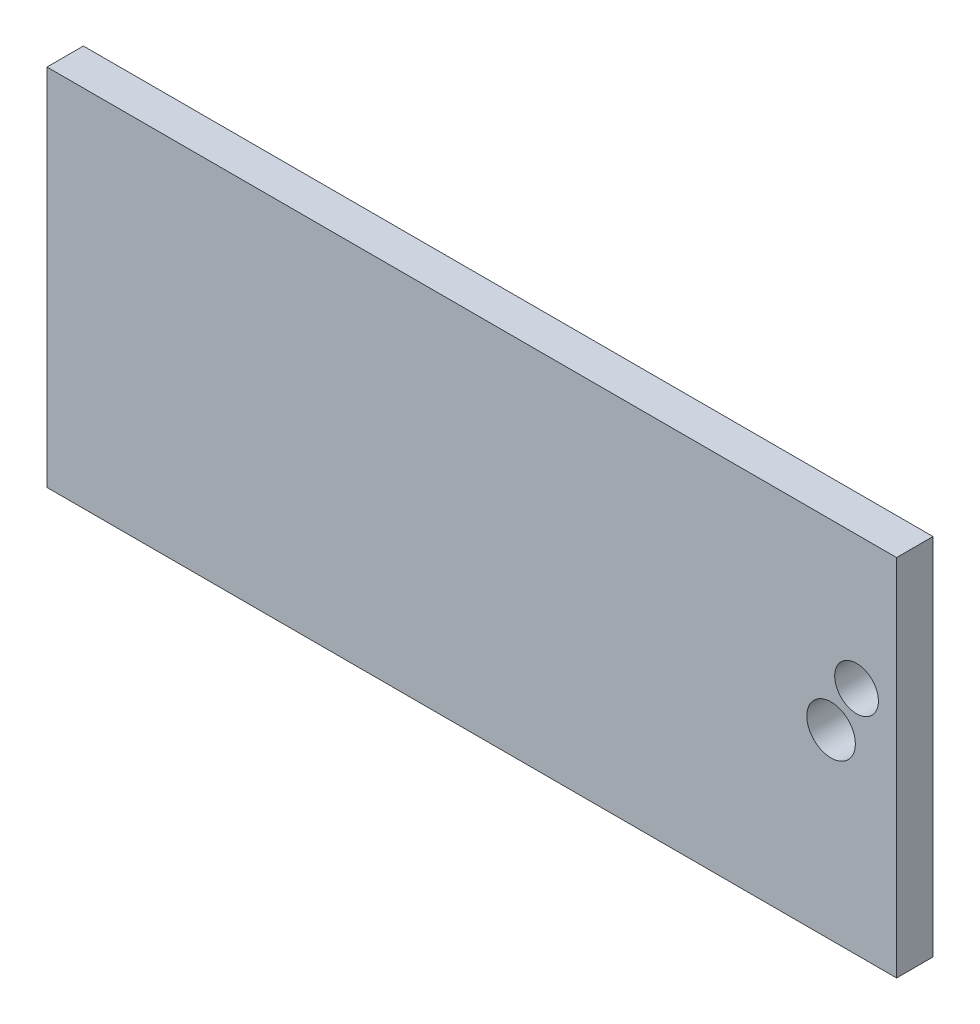
ISO-10303-21;
HEADER;
FILE_DESCRIPTION(('STEP AP214'),'2;1');
FILE_NAME('part.step','',(''),(''),'','','');
FILE_SCHEMA(('AUTOMOTIVE_DESIGN { 1 0 10303 214 1 1 1 1 }'));
ENDSEC;
DATA;
#1=APPLICATION_CONTEXT('core data for automotive mechanical design processes');
#2=APPLICATION_PROTOCOL_DEFINITION('international standard','automotive_design',2000,#1);
#3=PRODUCT_CONTEXT('',#1,'mechanical');
#4=PRODUCT('Part','Part','',(#3));
#5=PRODUCT_RELATED_PRODUCT_CATEGORY('part','',(#4));
#6=PRODUCT_DEFINITION_FORMATION('','',#4);
#7=PRODUCT_DEFINITION_CONTEXT('part definition',#1,'design');
#8=PRODUCT_DEFINITION('design','',#6,#7);
#9=PRODUCT_DEFINITION_SHAPE('','',#8);
#10=(LENGTH_UNIT() NAMED_UNIT(*) SI_UNIT(.MILLI.,.METRE.));
#11=(NAMED_UNIT(*) PLANE_ANGLE_UNIT() SI_UNIT($,.RADIAN.));
#12=(NAMED_UNIT(*) SI_UNIT($,.STERADIAN.) SOLID_ANGLE_UNIT());
#13=UNCERTAINTY_MEASURE_WITH_UNIT(LENGTH_MEASURE(1.E-05),#10,'distance_accuracy_value','');
#14=(GEOMETRIC_REPRESENTATION_CONTEXT(3) GLOBAL_UNCERTAINTY_ASSIGNED_CONTEXT((#13)) GLOBAL_UNIT_ASSIGNED_CONTEXT((#10,
#11,#12)) REPRESENTATION_CONTEXT('',''));
#15=CARTESIAN_POINT('',(0.,0.,0.));
#16=DIRECTION('',(0.,0.,1.));
#17=DIRECTION('',(1.,0.,0.));
#18=AXIS2_PLACEMENT_3D('',#15,#16,#17);
#19=CARTESIAN_POINT('',(0.,0.,15.));
#20=DIRECTION('',(1.,0.,0.));
#21=DIRECTION('',(0.,1.,0.));
#22=AXIS2_PLACEMENT_3D('',#19,#20,#21);
#23=PLANE('',#22);
#24=DIRECTION('',(0.,-1.,0.));
#25=VECTOR('',#24,1.);
#26=CARTESIAN_POINT('',(0.,0.,0.));
#27=LINE('',#26,#25);
#28=CARTESIAN_POINT('',(0.,0.,0.));
#29=VERTEX_POINT('',#28);
#30=CARTESIAN_POINT('',(0.,-150.,0.));
#31=VERTEX_POINT('',#30);
#32=EDGE_CURVE('E109',#29,#31,#27,.T.);
#33=ORIENTED_EDGE('',*,*,#32,.T.);
#34=DIRECTION('',(0.,0.,-1.));
#35=VECTOR('',#34,1.);
#36=CARTESIAN_POINT('',(0.,-150.,15.));
#37=LINE('',#36,#35);
#38=CARTESIAN_POINT('',(0.,-150.,15.));
#39=VERTEX_POINT('',#38);
#40=EDGE_CURVE('E11',#39,#31,#37,.T.);
#41=ORIENTED_EDGE('',*,*,#40,.F.);
#42=DIRECTION('',(0.,-1.,0.));
#43=VECTOR('',#42,1.);
#44=CARTESIAN_POINT('',(0.,0.,15.));
#45=LINE('',#44,#43);
#46=CARTESIAN_POINT('',(0.,0.,15.));
#47=VERTEX_POINT('',#46);
#48=EDGE_CURVE('E91',#47,#39,#45,.T.);
#49=ORIENTED_EDGE('',*,*,#48,.F.);
#50=DIRECTION('',(0.,0.,-1.));
#51=VECTOR('',#50,1.);
#52=CARTESIAN_POINT('',(0.,0.,15.));
#53=LINE('',#52,#51);
#54=EDGE_CURVE('E105',#47,#29,#53,.T.);
#55=ORIENTED_EDGE('',*,*,#54,.T.);
#56=EDGE_LOOP('',(#33,#41,#49,#55));
#57=FACE_BOUND('',#56,.T.);
#58=ADVANCED_FACE('F38',(#57),#23,.F.);
#59=CARTESIAN_POINT('',(0.,-150.,15.));
#60=DIRECTION('',(0.,1.,0.));
#61=DIRECTION('',(0.,0.,1.));
#62=AXIS2_PLACEMENT_3D('',#59,#60,#61);
#63=PLANE('',#62);
#64=DIRECTION('',(1.,0.,0.));
#65=VECTOR('',#64,1.);
#66=CARTESIAN_POINT('',(0.,-150.,0.));
#67=LINE('',#66,#65);
#68=CARTESIAN_POINT('',(350.,-150.,0.));
#69=VERTEX_POINT('',#68);
#70=EDGE_CURVE('E96',#31,#69,#67,.T.);
#71=ORIENTED_EDGE('',*,*,#70,.T.);
#72=DIRECTION('',(0.,0.,-1.));
#73=VECTOR('',#72,1.);
#74=CARTESIAN_POINT('',(350.,-150.,15.));
#75=LINE('',#74,#73);
#76=CARTESIAN_POINT('',(350.,-150.,15.));
#77=VERTEX_POINT('',#76);
#78=EDGE_CURVE('E48',#77,#69,#75,.T.);
#79=ORIENTED_EDGE('',*,*,#78,.F.);
#80=DIRECTION('',(1.,0.,0.));
#81=VECTOR('',#80,1.);
#82=CARTESIAN_POINT('',(0.,-150.,15.));
#83=LINE('',#82,#81);
#84=EDGE_CURVE('E86',#39,#77,#83,.T.);
#85=ORIENTED_EDGE('',*,*,#84,.F.);
#86=ORIENTED_EDGE('',*,*,#40,.T.);
#87=EDGE_LOOP('',(#71,#79,#85,#86));
#88=FACE_BOUND('',#87,.T.);
#89=ADVANCED_FACE('F95',(#88),#63,.F.);
#90=CARTESIAN_POINT('',(350.,0.,15.));
#91=DIRECTION('',(-1.,0.,0.));
#92=DIRECTION('',(0.,0.,1.));
#93=AXIS2_PLACEMENT_3D('',#90,#91,#92);
#94=PLANE('',#93);
#95=DIRECTION('',(0.,1.,0.));
#96=VECTOR('',#95,1.);
#97=CARTESIAN_POINT('',(350.,0.,0.));
#98=LINE('',#97,#96);
#99=CARTESIAN_POINT('',(350.,0.,0.));
#100=VERTEX_POINT('',#99);
#101=EDGE_CURVE('E73',#69,#100,#98,.T.);
#102=ORIENTED_EDGE('',*,*,#101,.T.);
#103=DIRECTION('',(0.,0.,-1.));
#104=VECTOR('',#103,1.);
#105=CARTESIAN_POINT('',(350.,0.,15.));
#106=LINE('',#105,#104);
#107=CARTESIAN_POINT('',(350.,0.,15.));
#108=VERTEX_POINT('',#107);
#109=EDGE_CURVE('E98',#108,#100,#106,.T.);
#110=ORIENTED_EDGE('',*,*,#109,.F.);
#111=DIRECTION('',(0.,1.,0.));
#112=VECTOR('',#111,1.);
#113=CARTESIAN_POINT('',(350.,0.,15.));
#114=LINE('',#113,#112);
#115=EDGE_CURVE('E89',#77,#108,#114,.T.);
#116=ORIENTED_EDGE('',*,*,#115,.F.);
#117=ORIENTED_EDGE('',*,*,#78,.T.);
#118=EDGE_LOOP('',(#102,#110,#116,#117));
#119=FACE_BOUND('',#118,.T.);
#120=ADVANCED_FACE('F100',(#119),#94,.F.);
#121=CARTESIAN_POINT('',(0.,0.,15.));
#122=DIRECTION('',(0.,-1.,0.));
#123=DIRECTION('',(0.,0.,-1.));
#124=AXIS2_PLACEMENT_3D('',#121,#122,#123);
#125=PLANE('',#124);
#126=DIRECTION('',(-1.,0.,0.));
#127=VECTOR('',#126,1.);
#128=CARTESIAN_POINT('',(0.,0.,0.));
#129=LINE('',#128,#127);
#130=EDGE_CURVE('E79',#100,#29,#129,.T.);
#131=ORIENTED_EDGE('',*,*,#130,.T.);
#132=ORIENTED_EDGE('',*,*,#54,.F.);
#133=DIRECTION('',(-1.,0.,0.));
#134=VECTOR('',#133,1.);
#135=CARTESIAN_POINT('',(0.,0.,15.));
#136=LINE('',#135,#134);
#137=EDGE_CURVE('E56',#108,#47,#136,.T.);
#138=ORIENTED_EDGE('',*,*,#137,.F.);
#139=ORIENTED_EDGE('',*,*,#109,.T.);
#140=EDGE_LOOP('',(#131,#132,#138,#139));
#141=FACE_BOUND('',#140,.T.);
#142=ADVANCED_FACE('F124',(#141),#125,.F.);
#143=CARTESIAN_POINT('',(0.,0.,15.));
#144=DIRECTION('',(0.,0.,1.));
#145=DIRECTION('',(1.,0.,0.));
#146=AXIS2_PLACEMENT_3D('',#143,#144,#145);
#147=PLANE('',#146);
#148=CARTESIAN_POINT('',(333.5,-54.9761356270419,15.));
#149=DIRECTION('',(0.,0.,1.));
#150=DIRECTION('',(1.,0.,0.));
#151=AXIS2_PLACEMENT_3D('',#148,#149,#150);
#152=CIRCLE('',#151,8.99999999999998);
#153=CARTESIAN_POINT('',(342.5,-54.9761356270419,15.));
#154=VERTEX_POINT('',#153);
#155=EDGE_CURVE('E139',#154,#154,#152,.T.);
#156=ORIENTED_EDGE('',*,*,#155,.F.);
#157=EDGE_LOOP('',(#156));
#158=FACE_BOUND('',#157,.T.);
#159=CARTESIAN_POINT('',(323.,-75.,15.));
#160=DIRECTION('',(0.,0.,-1.));
#161=DIRECTION('',(-1.,0.,0.));
#162=AXIS2_PLACEMENT_3D('',#159,#160,#161);
#163=CIRCLE('',#162,9.99999999999998);
#164=CARTESIAN_POINT('',(313.,-75.,15.));
#165=VERTEX_POINT('',#164);
#166=EDGE_CURVE('E113',#165,#165,#163,.T.);
#167=ORIENTED_EDGE('',*,*,#166,.T.);
#168=EDGE_LOOP('',(#167));
#169=FACE_BOUND('',#168,.T.);
#170=ORIENTED_EDGE('',*,*,#48,.T.);
#171=ORIENTED_EDGE('',*,*,#84,.T.);
#172=ORIENTED_EDGE('',*,*,#115,.T.);
#173=ORIENTED_EDGE('',*,*,#137,.T.);
#174=EDGE_LOOP('',(#170,#171,#172,#173));
#175=FACE_BOUND('',#174,.T.);
#176=ADVANCED_FACE('F87',(#158,#169,#175),#147,.T.);
#177=CARTESIAN_POINT('',(0.,0.,0.));
#178=DIRECTION('',(0.,0.,1.));
#179=DIRECTION('',(1.,0.,0.));
#180=AXIS2_PLACEMENT_3D('',#177,#178,#179);
#181=PLANE('',#180);
#182=CARTESIAN_POINT('',(333.5,-54.9761356270419,0.));
#183=DIRECTION('',(0.,0.,1.));
#184=DIRECTION('',(1.,0.,0.));
#185=AXIS2_PLACEMENT_3D('',#182,#183,#184);
#186=CIRCLE('',#185,8.99999999999998);
#187=CARTESIAN_POINT('',(342.5,-54.9761356270419,0.));
#188=VERTEX_POINT('',#187);
#189=EDGE_CURVE('E41',#188,#188,#186,.T.);
#190=ORIENTED_EDGE('',*,*,#189,.T.);
#191=EDGE_LOOP('',(#190));
#192=FACE_BOUND('',#191,.T.);
#193=CARTESIAN_POINT('',(323.,-75.,0.));
#194=DIRECTION('',(0.,0.,-1.));
#195=DIRECTION('',(-1.,0.,0.));
#196=AXIS2_PLACEMENT_3D('',#193,#194,#195);
#197=CIRCLE('',#196,9.99999999999998);
#198=CARTESIAN_POINT('',(313.,-75.,0.));
#199=VERTEX_POINT('',#198);
#200=EDGE_CURVE('E132',#199,#199,#197,.T.);
#201=ORIENTED_EDGE('',*,*,#200,.F.);
#202=EDGE_LOOP('',(#201));
#203=FACE_BOUND('',#202,.T.);
#204=ORIENTED_EDGE('',*,*,#32,.F.);
#205=ORIENTED_EDGE('',*,*,#130,.F.);
#206=ORIENTED_EDGE('',*,*,#101,.F.);
#207=ORIENTED_EDGE('',*,*,#70,.F.);
#208=EDGE_LOOP('',(#204,#205,#206,#207));
#209=FACE_BOUND('',#208,.T.);
#210=ADVANCED_FACE('F127',(#192,#203,#209),#181,.F.);
#211=CARTESIAN_POINT('',(323.,-75.,15.));
#212=DIRECTION('',(0.,0.,-1.));
#213=DIRECTION('',(-1.,0.,0.));
#214=AXIS2_PLACEMENT_3D('',#211,#212,#213);
#215=CYLINDRICAL_SURFACE('',#214,9.99999999999998);
#216=ORIENTED_EDGE('',*,*,#166,.F.);
#217=EDGE_LOOP('',(#216));
#218=FACE_BOUND('',#217,.T.);
#219=ORIENTED_EDGE('',*,*,#200,.T.);
#220=EDGE_LOOP('',(#219));
#221=FACE_BOUND('',#220,.T.);
#222=ADVANCED_FACE('F154',(#218,#221),#215,.F.);
#223=CARTESIAN_POINT('',(333.5,-54.9761356270419,-5.));
#224=DIRECTION('',(0.,0.,1.));
#225=DIRECTION('',(1.,0.,0.));
#226=AXIS2_PLACEMENT_3D('',#223,#224,#225);
#227=CYLINDRICAL_SURFACE('',#226,8.99999999999998);
#228=ORIENTED_EDGE('',*,*,#155,.T.);
#229=EDGE_LOOP('',(#228));
#230=FACE_BOUND('',#229,.T.);
#231=ORIENTED_EDGE('',*,*,#189,.F.);
#232=EDGE_LOOP('',(#231));
#233=FACE_BOUND('',#232,.T.);
#234=ADVANCED_FACE('F152',(#230,#233),#227,.F.);
#235=CLOSED_SHELL('',(#58,#89,#120,#142,#176,#210,#222,#234));
#236=MANIFOLD_SOLID_BREP('B2',#235);
#237=ADVANCED_BREP_SHAPE_REPRESENTATION('',(#18,#236),#14);
#238=SHAPE_DEFINITION_REPRESENTATION(#9,#237);
ENDSEC;
END-ISO-10303-21;
